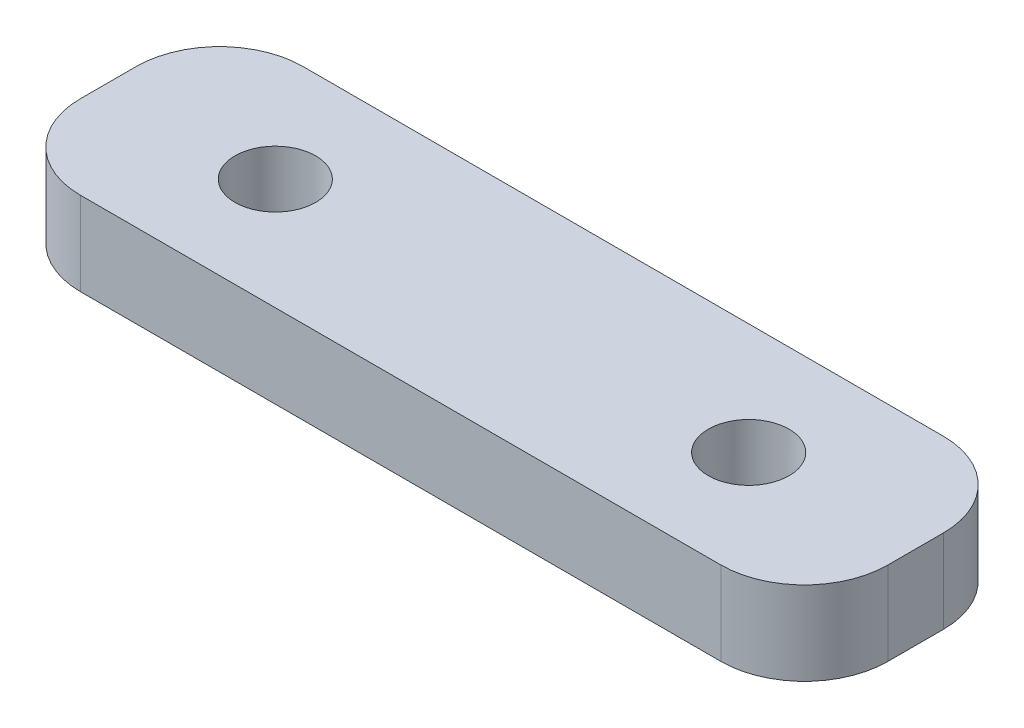
ISO-10303-21;
HEADER;
FILE_DESCRIPTION(('STEP AP214'),'2;1');
FILE_NAME('part.step','',(''),(''),'','','');
FILE_SCHEMA(('AUTOMOTIVE_DESIGN { 1 0 10303 214 1 1 1 1 }'));
ENDSEC;
DATA;
#1=APPLICATION_CONTEXT('core data for automotive mechanical design processes');
#2=APPLICATION_PROTOCOL_DEFINITION('international standard','automotive_design',2000,#1);
#3=PRODUCT_CONTEXT('',#1,'mechanical');
#4=PRODUCT('Part','Part','',(#3));
#5=PRODUCT_RELATED_PRODUCT_CATEGORY('part','',(#4));
#6=PRODUCT_DEFINITION_FORMATION('','',#4);
#7=PRODUCT_DEFINITION_CONTEXT('part definition',#1,'design');
#8=PRODUCT_DEFINITION('design','',#6,#7);
#9=PRODUCT_DEFINITION_SHAPE('','',#8);
#10=(LENGTH_UNIT() NAMED_UNIT(*) SI_UNIT(.MILLI.,.METRE.));
#11=(NAMED_UNIT(*) PLANE_ANGLE_UNIT() SI_UNIT($,.RADIAN.));
#12=(NAMED_UNIT(*) SI_UNIT($,.STERADIAN.) SOLID_ANGLE_UNIT());
#13=UNCERTAINTY_MEASURE_WITH_UNIT(LENGTH_MEASURE(1.E-05),#10,'distance_accuracy_value','');
#14=(GEOMETRIC_REPRESENTATION_CONTEXT(3) GLOBAL_UNCERTAINTY_ASSIGNED_CONTEXT((#13)) GLOBAL_UNIT_ASSIGNED_CONTEXT((#10,
#11,#12)) REPRESENTATION_CONTEXT('',''));
#15=CARTESIAN_POINT('',(0.,0.,0.));
#16=DIRECTION('',(0.,0.,1.));
#17=DIRECTION('',(1.,0.,0.));
#18=AXIS2_PLACEMENT_3D('',#15,#16,#17);
#19=CARTESIAN_POINT('',(0.,3.,0.));
#20=DIRECTION('',(1.,0.,0.));
#21=DIRECTION('',(0.,0.,-1.));
#22=AXIS2_PLACEMENT_3D('',#19,#20,#21);
#23=PLANE('',#22);
#24=DIRECTION('',(0.,0.,1.));
#25=VECTOR('',#24,1.);
#26=CARTESIAN_POINT('',(0.,3.,0.));
#27=LINE('',#26,#25);
#28=CARTESIAN_POINT('',(0.,3.,-5.));
#29=VERTEX_POINT('',#28);
#30=CARTESIAN_POINT('',(0.,3.,-3.));
#31=VERTEX_POINT('',#30);
#32=EDGE_CURVE('E117',#29,#31,#27,.T.);
#33=ORIENTED_EDGE('',*,*,#32,.F.);
#34=DIRECTION('',(0.,-1.,0.));
#35=VECTOR('',#34,1.);
#36=CARTESIAN_POINT('',(0.,3.,-5.));
#37=LINE('',#36,#35);
#38=CARTESIAN_POINT('',(0.,0.,-5.));
#39=VERTEX_POINT('',#38);
#40=EDGE_CURVE('E102',#29,#39,#37,.T.);
#41=ORIENTED_EDGE('',*,*,#40,.T.);
#42=DIRECTION('',(0.,0.,1.));
#43=VECTOR('',#42,1.);
#44=CARTESIAN_POINT('',(0.,0.,0.));
#45=LINE('',#44,#43);
#46=CARTESIAN_POINT('',(0.,0.,-3.));
#47=VERTEX_POINT('',#46);
#48=EDGE_CURVE('E114',#39,#47,#45,.T.);
#49=ORIENTED_EDGE('',*,*,#48,.T.);
#50=DIRECTION('',(0.,-1.,0.));
#51=VECTOR('',#50,1.);
#52=CARTESIAN_POINT('',(0.,3.,-3.));
#53=LINE('',#52,#51);
#54=EDGE_CURVE('E119',#47,#31,#53,.F.);
#55=ORIENTED_EDGE('',*,*,#54,.T.);
#56=EDGE_LOOP('',(#33,#41,#49,#55));
#57=FACE_BOUND('',#56,.T.);
#58=ADVANCED_FACE('F32',(#57),#23,.F.);
#59=CARTESIAN_POINT('',(0.,3.,0.));
#60=DIRECTION('',(0.,0.,-1.));
#61=DIRECTION('',(-1.,0.,0.));
#62=AXIS2_PLACEMENT_3D('',#59,#60,#61);
#63=PLANE('',#62);
#64=DIRECTION('',(1.,0.,0.));
#65=VECTOR('',#64,1.);
#66=CARTESIAN_POINT('',(0.,3.,0.));
#67=LINE('',#66,#65);
#68=CARTESIAN_POINT('',(3.,3.,0.));
#69=VERTEX_POINT('',#68);
#70=CARTESIAN_POINT('',(26.,3.,0.));
#71=VERTEX_POINT('',#70);
#72=EDGE_CURVE('E163',#69,#71,#67,.T.);
#73=ORIENTED_EDGE('',*,*,#72,.F.);
#74=DIRECTION('',(0.,-1.,0.));
#75=VECTOR('',#74,1.);
#76=CARTESIAN_POINT('',(3.,3.,0.));
#77=LINE('',#76,#75);
#78=CARTESIAN_POINT('',(3.,0.,0.));
#79=VERTEX_POINT('',#78);
#80=EDGE_CURVE('E156',#69,#79,#77,.T.);
#81=ORIENTED_EDGE('',*,*,#80,.T.);
#82=DIRECTION('',(1.,0.,0.));
#83=VECTOR('',#82,1.);
#84=CARTESIAN_POINT('',(0.,0.,0.));
#85=LINE('',#84,#83);
#86=CARTESIAN_POINT('',(26.,0.,0.));
#87=VERTEX_POINT('',#86);
#88=EDGE_CURVE('E123',#79,#87,#85,.T.);
#89=ORIENTED_EDGE('',*,*,#88,.T.);
#90=DIRECTION('',(0.,-1.,0.));
#91=VECTOR('',#90,1.);
#92=CARTESIAN_POINT('',(26.,3.,0.));
#93=LINE('',#92,#91);
#94=EDGE_CURVE('E154',#87,#71,#93,.F.);
#95=ORIENTED_EDGE('',*,*,#94,.T.);
#96=EDGE_LOOP('',(#73,#81,#89,#95));
#97=FACE_BOUND('',#96,.T.);
#98=ADVANCED_FACE('F161',(#97),#63,.F.);
#99=CARTESIAN_POINT('',(29.,3.,0.));
#100=DIRECTION('',(-1.,0.,0.));
#101=DIRECTION('',(0.,0.,1.));
#102=AXIS2_PLACEMENT_3D('',#99,#100,#101);
#103=PLANE('',#102);
#104=DIRECTION('',(0.,0.,-1.));
#105=VECTOR('',#104,1.);
#106=CARTESIAN_POINT('',(29.,3.,0.));
#107=LINE('',#106,#105);
#108=CARTESIAN_POINT('',(29.,3.,-3.));
#109=VERTEX_POINT('',#108);
#110=CARTESIAN_POINT('',(29.,3.,-5.));
#111=VERTEX_POINT('',#110);
#112=EDGE_CURVE('E171',#109,#111,#107,.T.);
#113=ORIENTED_EDGE('',*,*,#112,.F.);
#114=DIRECTION('',(0.,-1.,0.));
#115=VECTOR('',#114,1.);
#116=CARTESIAN_POINT('',(29.,3.,-3.));
#117=LINE('',#116,#115);
#118=CARTESIAN_POINT('',(29.,0.,-3.));
#119=VERTEX_POINT('',#118);
#120=EDGE_CURVE('E11',#109,#119,#117,.T.);
#121=ORIENTED_EDGE('',*,*,#120,.T.);
#122=DIRECTION('',(0.,0.,-1.));
#123=VECTOR('',#122,1.);
#124=CARTESIAN_POINT('',(29.,0.,0.));
#125=LINE('',#124,#123);
#126=CARTESIAN_POINT('',(29.,0.,-5.));
#127=VERTEX_POINT('',#126);
#128=EDGE_CURVE('E127',#119,#127,#125,.T.);
#129=ORIENTED_EDGE('',*,*,#128,.T.);
#130=DIRECTION('',(0.,-1.,0.));
#131=VECTOR('',#130,1.);
#132=CARTESIAN_POINT('',(29.,3.,-5.));
#133=LINE('',#132,#131);
#134=EDGE_CURVE('E40',#127,#111,#133,.F.);
#135=ORIENTED_EDGE('',*,*,#134,.T.);
#136=EDGE_LOOP('',(#113,#121,#129,#135));
#137=FACE_BOUND('',#136,.T.);
#138=ADVANCED_FACE('F170',(#137),#103,.F.);
#139=CARTESIAN_POINT('',(0.,3.,-8.));
#140=DIRECTION('',(0.,0.,1.));
#141=DIRECTION('',(1.,0.,0.));
#142=AXIS2_PLACEMENT_3D('',#139,#140,#141);
#143=PLANE('',#142);
#144=DIRECTION('',(-1.,0.,0.));
#145=VECTOR('',#144,1.);
#146=CARTESIAN_POINT('',(0.,0.,-8.));
#147=LINE('',#146,#145);
#148=CARTESIAN_POINT('',(26.,0.,-8.));
#149=VERTEX_POINT('',#148);
#150=CARTESIAN_POINT('',(3.,0.,-8.));
#151=VERTEX_POINT('',#150);
#152=EDGE_CURVE('E137',#149,#151,#147,.T.);
#153=ORIENTED_EDGE('',*,*,#152,.T.);
#154=DIRECTION('',(0.,-1.,0.));
#155=VECTOR('',#154,1.);
#156=CARTESIAN_POINT('',(3.,3.,-8.));
#157=LINE('',#156,#155);
#158=CARTESIAN_POINT('',(3.,3.,-8.));
#159=VERTEX_POINT('',#158);
#160=EDGE_CURVE('E103',#151,#159,#157,.F.);
#161=ORIENTED_EDGE('',*,*,#160,.T.);
#162=DIRECTION('',(-1.,0.,0.));
#163=VECTOR('',#162,1.);
#164=CARTESIAN_POINT('',(0.,3.,-8.));
#165=LINE('',#164,#163);
#166=CARTESIAN_POINT('',(26.,3.,-8.));
#167=VERTEX_POINT('',#166);
#168=EDGE_CURVE('E133',#167,#159,#165,.T.);
#169=ORIENTED_EDGE('',*,*,#168,.F.);
#170=DIRECTION('',(0.,-1.,0.));
#171=VECTOR('',#170,1.);
#172=CARTESIAN_POINT('',(26.,3.,-8.));
#173=LINE('',#172,#171);
#174=EDGE_CURVE('E108',#167,#149,#173,.T.);
#175=ORIENTED_EDGE('',*,*,#174,.T.);
#176=EDGE_LOOP('',(#153,#161,#169,#175));
#177=FACE_BOUND('',#176,.T.);
#178=ADVANCED_FACE('F192',(#177),#143,.F.);
#179=CARTESIAN_POINT('',(0.,3.,0.));
#180=DIRECTION('',(0.,-1.,0.));
#181=DIRECTION('',(0.,0.,-1.));
#182=AXIS2_PLACEMENT_3D('',#179,#180,#181);
#183=PLANE('',#182);
#184=CARTESIAN_POINT('',(6.,3.,-4.));
#185=DIRECTION('',(0.,1.,0.));
#186=DIRECTION('',(0.,0.,1.));
#187=AXIS2_PLACEMENT_3D('',#184,#185,#186);
#188=CIRCLE('',#187,1.45);
#189=CARTESIAN_POINT('',(6.,3.,-2.55));
#190=VERTEX_POINT('',#189);
#191=EDGE_CURVE('E182',#190,#190,#188,.T.);
#192=ORIENTED_EDGE('',*,*,#191,.F.);
#193=EDGE_LOOP('',(#192));
#194=FACE_BOUND('',#193,.T.);
#195=CARTESIAN_POINT('',(23.,3.,-4.));
#196=DIRECTION('',(0.,1.,0.));
#197=DIRECTION('',(0.,0.,1.));
#198=AXIS2_PLACEMENT_3D('',#195,#196,#197);
#199=CIRCLE('',#198,1.45);
#200=CARTESIAN_POINT('',(23.,3.,-2.55));
#201=VERTEX_POINT('',#200);
#202=EDGE_CURVE('E130',#201,#201,#199,.T.);
#203=ORIENTED_EDGE('',*,*,#202,.F.);
#204=EDGE_LOOP('',(#203));
#205=FACE_BOUND('',#204,.T.);
#206=ORIENTED_EDGE('',*,*,#168,.T.);
#207=CARTESIAN_POINT('',(3.,3.,-5.));
#208=DIRECTION('',(0.,-1.,0.));
#209=DIRECTION('',(0.,0.,-1.));
#210=AXIS2_PLACEMENT_3D('',#207,#208,#209);
#211=CIRCLE('',#210,3.);
#212=EDGE_CURVE('E152',#159,#29,#211,.F.);
#213=ORIENTED_EDGE('',*,*,#212,.T.);
#214=ORIENTED_EDGE('',*,*,#32,.T.);
#215=CARTESIAN_POINT('',(3.,3.,-3.));
#216=DIRECTION('',(0.,-1.,0.));
#217=DIRECTION('',(0.,0.,-1.));
#218=AXIS2_PLACEMENT_3D('',#215,#216,#217);
#219=CIRCLE('',#218,3.);
#220=EDGE_CURVE('E150',#31,#69,#219,.F.);
#221=ORIENTED_EDGE('',*,*,#220,.T.);
#222=ORIENTED_EDGE('',*,*,#72,.T.);
#223=CARTESIAN_POINT('',(26.,3.,-3.));
#224=DIRECTION('',(0.,-1.,0.));
#225=DIRECTION('',(0.,0.,-1.));
#226=AXIS2_PLACEMENT_3D('',#223,#224,#225);
#227=CIRCLE('',#226,3.);
#228=EDGE_CURVE('E53',#71,#109,#227,.F.);
#229=ORIENTED_EDGE('',*,*,#228,.T.);
#230=ORIENTED_EDGE('',*,*,#112,.T.);
#231=CARTESIAN_POINT('',(26.,3.,-5.));
#232=DIRECTION('',(0.,-1.,0.));
#233=DIRECTION('',(0.,0.,-1.));
#234=AXIS2_PLACEMENT_3D('',#231,#232,#233);
#235=CIRCLE('',#234,3.);
#236=EDGE_CURVE('E147',#111,#167,#235,.F.);
#237=ORIENTED_EDGE('',*,*,#236,.T.);
#238=EDGE_LOOP('',(#206,#213,#214,#221,#222,#229,#230,#237));
#239=FACE_BOUND('',#238,.T.);
#240=ADVANCED_FACE('F189',(#194,#205,#239),#183,.F.);
#241=CARTESIAN_POINT('',(0.,0.,0.));
#242=DIRECTION('',(0.,-1.,0.));
#243=DIRECTION('',(0.,0.,-1.));
#244=AXIS2_PLACEMENT_3D('',#241,#242,#243);
#245=PLANE('',#244);
#246=CARTESIAN_POINT('',(6.,0.,-4.));
#247=DIRECTION('',(0.,-1.,0.));
#248=DIRECTION('',(0.,0.,-1.));
#249=AXIS2_PLACEMENT_3D('',#246,#247,#248);
#250=CIRCLE('',#249,1.45);
#251=CARTESIAN_POINT('',(6.,0.,-5.45));
#252=VERTEX_POINT('',#251);
#253=EDGE_CURVE('E179',#252,#252,#250,.T.);
#254=ORIENTED_EDGE('',*,*,#253,.F.);
#255=EDGE_LOOP('',(#254));
#256=FACE_BOUND('',#255,.T.);
#257=CARTESIAN_POINT('',(23.,0.,-4.));
#258=DIRECTION('',(0.,-1.,0.));
#259=DIRECTION('',(0.,0.,-1.));
#260=AXIS2_PLACEMENT_3D('',#257,#258,#259);
#261=CIRCLE('',#260,1.45);
#262=CARTESIAN_POINT('',(23.,0.,-5.45));
#263=VERTEX_POINT('',#262);
#264=EDGE_CURVE('E124',#263,#263,#261,.T.);
#265=ORIENTED_EDGE('',*,*,#264,.F.);
#266=EDGE_LOOP('',(#265));
#267=FACE_BOUND('',#266,.T.);
#268=ORIENTED_EDGE('',*,*,#48,.F.);
#269=CARTESIAN_POINT('',(3.,0.,-5.));
#270=DIRECTION('',(0.,-1.,0.));
#271=DIRECTION('',(0.,0.,-1.));
#272=AXIS2_PLACEMENT_3D('',#269,#270,#271);
#273=CIRCLE('',#272,3.);
#274=EDGE_CURVE('E98',#39,#151,#273,.T.);
#275=ORIENTED_EDGE('',*,*,#274,.T.);
#276=ORIENTED_EDGE('',*,*,#152,.F.);
#277=CARTESIAN_POINT('',(26.,0.,-5.));
#278=DIRECTION('',(0.,-1.,0.));
#279=DIRECTION('',(0.,0.,-1.));
#280=AXIS2_PLACEMENT_3D('',#277,#278,#279);
#281=CIRCLE('',#280,3.);
#282=EDGE_CURVE('E118',#149,#127,#281,.T.);
#283=ORIENTED_EDGE('',*,*,#282,.T.);
#284=ORIENTED_EDGE('',*,*,#128,.F.);
#285=CARTESIAN_POINT('',(26.,0.,-3.));
#286=DIRECTION('',(0.,-1.,0.));
#287=DIRECTION('',(0.,0.,-1.));
#288=AXIS2_PLACEMENT_3D('',#285,#286,#287);
#289=CIRCLE('',#288,3.);
#290=EDGE_CURVE('E141',#119,#87,#289,.T.);
#291=ORIENTED_EDGE('',*,*,#290,.T.);
#292=ORIENTED_EDGE('',*,*,#88,.F.);
#293=CARTESIAN_POINT('',(3.,0.,-3.));
#294=DIRECTION('',(0.,-1.,0.));
#295=DIRECTION('',(0.,0.,-1.));
#296=AXIS2_PLACEMENT_3D('',#293,#294,#295);
#297=CIRCLE('',#296,3.);
#298=EDGE_CURVE('E109',#79,#47,#297,.T.);
#299=ORIENTED_EDGE('',*,*,#298,.T.);
#300=EDGE_LOOP('',(#268,#275,#276,#283,#284,#291,#292,#299));
#301=FACE_BOUND('',#300,.T.);
#302=ADVANCED_FACE('F121',(#256,#267,#301),#245,.T.);
#303=CARTESIAN_POINT('',(23.,3.,-4.));
#304=DIRECTION('',(0.,1.,0.));
#305=DIRECTION('',(0.,0.,1.));
#306=AXIS2_PLACEMENT_3D('',#303,#304,#305);
#307=CYLINDRICAL_SURFACE('',#306,1.45);
#308=ORIENTED_EDGE('',*,*,#202,.T.);
#309=EDGE_LOOP('',(#308));
#310=FACE_BOUND('',#309,.T.);
#311=ORIENTED_EDGE('',*,*,#264,.T.);
#312=EDGE_LOOP('',(#311));
#313=FACE_BOUND('',#312,.T.);
#314=ADVANCED_FACE('F244',(#310,#313),#307,.F.);
#315=CARTESIAN_POINT('',(6.,3.,-4.));
#316=DIRECTION('',(0.,1.,0.));
#317=DIRECTION('',(0.,0.,1.));
#318=AXIS2_PLACEMENT_3D('',#315,#316,#317);
#319=CYLINDRICAL_SURFACE('',#318,1.45);
#320=ORIENTED_EDGE('',*,*,#191,.T.);
#321=EDGE_LOOP('',(#320));
#322=FACE_BOUND('',#321,.T.);
#323=ORIENTED_EDGE('',*,*,#253,.T.);
#324=EDGE_LOOP('',(#323));
#325=FACE_BOUND('',#324,.T.);
#326=ADVANCED_FACE('F186',(#322,#325),#319,.F.);
#327=CARTESIAN_POINT('',(3.,3.,-5.));
#328=DIRECTION('',(0.,-1.,0.));
#329=DIRECTION('',(0.,0.,-1.));
#330=AXIS2_PLACEMENT_3D('',#327,#328,#329);
#331=CYLINDRICAL_SURFACE('',#330,3.);
#332=ORIENTED_EDGE('',*,*,#212,.F.);
#333=ORIENTED_EDGE('',*,*,#160,.F.);
#334=ORIENTED_EDGE('',*,*,#274,.F.);
#335=ORIENTED_EDGE('',*,*,#40,.F.);
#336=EDGE_LOOP('',(#332,#333,#334,#335));
#337=FACE_BOUND('',#336,.T.);
#338=ADVANCED_FACE('F101',(#337),#331,.T.);
#339=CARTESIAN_POINT('',(3.,3.,-3.));
#340=DIRECTION('',(0.,-1.,0.));
#341=DIRECTION('',(0.,0.,-1.));
#342=AXIS2_PLACEMENT_3D('',#339,#340,#341);
#343=CYLINDRICAL_SURFACE('',#342,3.);
#344=ORIENTED_EDGE('',*,*,#220,.F.);
#345=ORIENTED_EDGE('',*,*,#54,.F.);
#346=ORIENTED_EDGE('',*,*,#298,.F.);
#347=ORIENTED_EDGE('',*,*,#80,.F.);
#348=EDGE_LOOP('',(#344,#345,#346,#347));
#349=FACE_BOUND('',#348,.T.);
#350=ADVANCED_FACE('F203',(#349),#343,.T.);
#351=CARTESIAN_POINT('',(26.,3.,-3.));
#352=DIRECTION('',(0.,-1.,0.));
#353=DIRECTION('',(0.,0.,-1.));
#354=AXIS2_PLACEMENT_3D('',#351,#352,#353);
#355=CYLINDRICAL_SURFACE('',#354,3.);
#356=ORIENTED_EDGE('',*,*,#228,.F.);
#357=ORIENTED_EDGE('',*,*,#94,.F.);
#358=ORIENTED_EDGE('',*,*,#290,.F.);
#359=ORIENTED_EDGE('',*,*,#120,.F.);
#360=EDGE_LOOP('',(#356,#357,#358,#359));
#361=FACE_BOUND('',#360,.T.);
#362=ADVANCED_FACE('F169',(#361),#355,.T.);
#363=CARTESIAN_POINT('',(26.,3.,-5.));
#364=DIRECTION('',(0.,-1.,0.));
#365=DIRECTION('',(0.,0.,-1.));
#366=AXIS2_PLACEMENT_3D('',#363,#364,#365);
#367=CYLINDRICAL_SURFACE('',#366,3.);
#368=ORIENTED_EDGE('',*,*,#236,.F.);
#369=ORIENTED_EDGE('',*,*,#134,.F.);
#370=ORIENTED_EDGE('',*,*,#282,.F.);
#371=ORIENTED_EDGE('',*,*,#174,.F.);
#372=EDGE_LOOP('',(#368,#369,#370,#371));
#373=FACE_BOUND('',#372,.T.);
#374=ADVANCED_FACE('F34',(#373),#367,.T.);
#375=CLOSED_SHELL('',(#58,#98,#138,#178,#240,#302,#314,#326,#338,#350,#362,#374));
#376=MANIFOLD_SOLID_BREP('B2',#375);
#377=ADVANCED_BREP_SHAPE_REPRESENTATION('',(#18,#376),#14);
#378=SHAPE_DEFINITION_REPRESENTATION(#9,#377);
ENDSEC;
END-ISO-10303-21;
